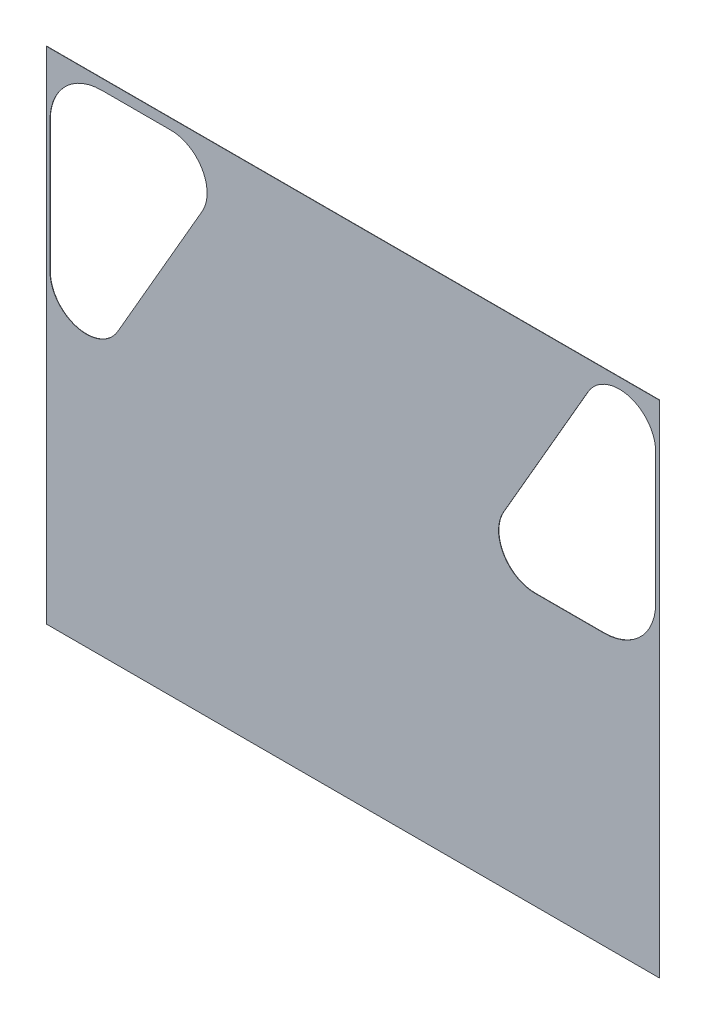
ISO-10303-21;
HEADER;
FILE_DESCRIPTION(('STEP AP214'),'2;1');
FILE_NAME('part.step','',(''),(''),'','','');
FILE_SCHEMA(('AUTOMOTIVE_DESIGN { 1 0 10303 214 1 1 1 1 }'));
ENDSEC;
DATA;
#1=APPLICATION_CONTEXT('core data for automotive mechanical design processes');
#2=APPLICATION_PROTOCOL_DEFINITION('international standard','automotive_design',2000,#1);
#3=PRODUCT_CONTEXT('',#1,'mechanical');
#4=PRODUCT('Part','Part','',(#3));
#5=PRODUCT_RELATED_PRODUCT_CATEGORY('part','',(#4));
#6=PRODUCT_DEFINITION_FORMATION('','',#4);
#7=PRODUCT_DEFINITION_CONTEXT('part definition',#1,'design');
#8=PRODUCT_DEFINITION('design','',#6,#7);
#9=PRODUCT_DEFINITION_SHAPE('','',#8);
#10=(LENGTH_UNIT() NAMED_UNIT(*) SI_UNIT(.MILLI.,.METRE.));
#11=(NAMED_UNIT(*) PLANE_ANGLE_UNIT() SI_UNIT($,.RADIAN.));
#12=(NAMED_UNIT(*) SI_UNIT($,.STERADIAN.) SOLID_ANGLE_UNIT());
#13=UNCERTAINTY_MEASURE_WITH_UNIT(LENGTH_MEASURE(1.E-05),#10,'distance_accuracy_value','');
#14=(GEOMETRIC_REPRESENTATION_CONTEXT(3) GLOBAL_UNCERTAINTY_ASSIGNED_CONTEXT((#13)) GLOBAL_UNIT_ASSIGNED_CONTEXT((#10,
#11,#12)) REPRESENTATION_CONTEXT('',''));
#15=CARTESIAN_POINT('',(0.,0.,0.));
#16=DIRECTION('',(0.,0.,1.));
#17=DIRECTION('',(1.,0.,0.));
#18=AXIS2_PLACEMENT_3D('',#15,#16,#17);
#19=CARTESIAN_POINT('',(0.,0.,1.));
#20=DIRECTION('',(1.,0.,0.));
#21=DIRECTION('',(0.,1.,0.));
#22=AXIS2_PLACEMENT_3D('',#19,#20,#21);
#23=PLANE('',#22);
#24=DIRECTION('',(0.,-1.,0.));
#25=VECTOR('',#24,1.);
#26=CARTESIAN_POINT('',(0.,0.,0.));
#27=LINE('',#26,#25);
#28=CARTESIAN_POINT('',(-4.44089209850063E-13,1625.,0.));
#29=VERTEX_POINT('',#28);
#30=CARTESIAN_POINT('',(0.,0.,0.));
#31=VERTEX_POINT('',#30);
#32=EDGE_CURVE('E195',#29,#31,#27,.T.);
#33=ORIENTED_EDGE('',*,*,#32,.T.);
#34=DIRECTION('',(0.,0.,-1.));
#35=VECTOR('',#34,1.);
#36=CARTESIAN_POINT('',(0.,0.,1.));
#37=LINE('',#36,#35);
#38=CARTESIAN_POINT('',(0.,0.,1.));
#39=VERTEX_POINT('',#38);
#40=EDGE_CURVE('E11',#39,#31,#37,.T.);
#41=ORIENTED_EDGE('',*,*,#40,.F.);
#42=DIRECTION('',(0.,-1.,0.));
#43=VECTOR('',#42,1.);
#44=CARTESIAN_POINT('',(0.,0.,1.));
#45=LINE('',#44,#43);
#46=CARTESIAN_POINT('',(-4.44089209850063E-13,1625.,1.));
#47=VERTEX_POINT('',#46);
#48=EDGE_CURVE('E248',#47,#39,#45,.T.);
#49=ORIENTED_EDGE('',*,*,#48,.F.);
#50=DIRECTION('',(0.,0.,-1.));
#51=VECTOR('',#50,1.);
#52=CARTESIAN_POINT('',(-4.44089209850063E-13,1625.,1.));
#53=LINE('',#52,#51);
#54=EDGE_CURVE('E258',#47,#29,#53,.T.);
#55=ORIENTED_EDGE('',*,*,#54,.T.);
#56=EDGE_LOOP('',(#33,#41,#49,#55));
#57=FACE_BOUND('',#56,.T.);
#58=ADVANCED_FACE('F34',(#57),#23,.F.);
#59=CARTESIAN_POINT('',(0.,0.,1.));
#60=DIRECTION('',(0.,1.,0.));
#61=DIRECTION('',(0.,0.,1.));
#62=AXIS2_PLACEMENT_3D('',#59,#60,#61);
#63=PLANE('',#62);
#64=DIRECTION('',(1.,0.,0.));
#65=VECTOR('',#64,1.);
#66=CARTESIAN_POINT('',(0.,0.,0.));
#67=LINE('',#66,#65);
#68=CARTESIAN_POINT('',(1991.,0.,0.));
#69=VERTEX_POINT('',#68);
#70=EDGE_CURVE('E261',#31,#69,#67,.T.);
#71=ORIENTED_EDGE('',*,*,#70,.T.);
#72=DIRECTION('',(0.,0.,-1.));
#73=VECTOR('',#72,1.);
#74=CARTESIAN_POINT('',(1991.,0.,1.));
#75=LINE('',#74,#73);
#76=CARTESIAN_POINT('',(1991.,0.,1.));
#77=VERTEX_POINT('',#76);
#78=EDGE_CURVE('E41',#77,#69,#75,.T.);
#79=ORIENTED_EDGE('',*,*,#78,.F.);
#80=DIRECTION('',(1.,0.,0.));
#81=VECTOR('',#80,1.);
#82=CARTESIAN_POINT('',(0.,0.,1.));
#83=LINE('',#82,#81);
#84=EDGE_CURVE('E251',#39,#77,#83,.T.);
#85=ORIENTED_EDGE('',*,*,#84,.F.);
#86=ORIENTED_EDGE('',*,*,#40,.T.);
#87=EDGE_LOOP('',(#71,#79,#85,#86));
#88=FACE_BOUND('',#87,.T.);
#89=ADVANCED_FACE('F290',(#88),#63,.F.);
#90=CARTESIAN_POINT('',(1991.,0.,1.));
#91=DIRECTION('',(-1.,0.,0.));
#92=DIRECTION('',(0.,-1.,0.));
#93=AXIS2_PLACEMENT_3D('',#90,#91,#92);
#94=PLANE('',#93);
#95=DIRECTION('',(0.,1.,0.));
#96=VECTOR('',#95,1.);
#97=CARTESIAN_POINT('',(1991.,0.,0.));
#98=LINE('',#97,#96);
#99=CARTESIAN_POINT('',(1991.,1625.,0.));
#100=VERTEX_POINT('',#99);
#101=EDGE_CURVE('E263',#69,#100,#98,.T.);
#102=ORIENTED_EDGE('',*,*,#101,.T.);
#103=DIRECTION('',(0.,0.,-1.));
#104=VECTOR('',#103,1.);
#105=CARTESIAN_POINT('',(1991.,1625.,1.));
#106=LINE('',#105,#104);
#107=CARTESIAN_POINT('',(1991.,1625.,1.));
#108=VERTEX_POINT('',#107);
#109=EDGE_CURVE('E268',#108,#100,#106,.T.);
#110=ORIENTED_EDGE('',*,*,#109,.F.);
#111=DIRECTION('',(0.,1.,0.));
#112=VECTOR('',#111,1.);
#113=CARTESIAN_POINT('',(1991.,0.,1.));
#114=LINE('',#113,#112);
#115=EDGE_CURVE('E254',#77,#108,#114,.T.);
#116=ORIENTED_EDGE('',*,*,#115,.F.);
#117=ORIENTED_EDGE('',*,*,#78,.T.);
#118=EDGE_LOOP('',(#102,#110,#116,#117));
#119=FACE_BOUND('',#118,.T.);
#120=ADVANCED_FACE('F275',(#119),#94,.F.);
#121=CARTESIAN_POINT('',(-4.44089209850063E-13,1625.,1.));
#122=DIRECTION('',(0.,-1.,0.));
#123=DIRECTION('',(0.,0.,-1.));
#124=AXIS2_PLACEMENT_3D('',#121,#122,#123);
#125=PLANE('',#124);
#126=DIRECTION('',(-1.,0.,0.));
#127=VECTOR('',#126,1.);
#128=CARTESIAN_POINT('',(-4.44089209850063E-13,1625.,0.));
#129=LINE('',#128,#127);
#130=EDGE_CURVE('E252',#100,#29,#129,.T.);
#131=ORIENTED_EDGE('',*,*,#130,.T.);
#132=ORIENTED_EDGE('',*,*,#54,.F.);
#133=DIRECTION('',(-1.,0.,0.));
#134=VECTOR('',#133,1.);
#135=CARTESIAN_POINT('',(-4.44089209850063E-13,1625.,1.));
#136=LINE('',#135,#134);
#137=EDGE_CURVE('E256',#108,#47,#136,.T.);
#138=ORIENTED_EDGE('',*,*,#137,.F.);
#139=ORIENTED_EDGE('',*,*,#109,.T.);
#140=EDGE_LOOP('',(#131,#132,#138,#139));
#141=FACE_BOUND('',#140,.T.);
#142=ADVANCED_FACE('F283',(#141),#125,.F.);
#143=CARTESIAN_POINT('',(0.,0.,1.));
#144=DIRECTION('',(0.,0.,-1.));
#145=DIRECTION('',(-1.,0.,0.));
#146=AXIS2_PLACEMENT_3D('',#143,#144,#145);
#147=PLANE('',#146);
#148=DIRECTION('',(0.,1.,0.));
#149=VECTOR('',#148,1.);
#150=CARTESIAN_POINT('',(1979.,1048.,0.99999999999989));
#151=LINE('',#150,#149);
#152=CARTESIAN_POINT('',(1979.,1048.,1.));
#153=VERTEX_POINT('',#152);
#154=CARTESIAN_POINT('',(1979.,1473.,0.99999999999989));
#155=VERTEX_POINT('',#154);
#156=EDGE_CURVE('E182',#153,#155,#151,.T.);
#157=ORIENTED_EDGE('',*,*,#156,.F.);
#158=CARTESIAN_POINT('',(1811.,1048.,0.99999999999989));
#159=DIRECTION('',(0.,0.,1.));
#160=DIRECTION('',(1.,0.,0.));
#161=AXIS2_PLACEMENT_3D('',#158,#159,#160);
#162=CIRCLE('',#161,168.);
#163=CARTESIAN_POINT('',(1811.,880.,0.99999999999989));
#164=VERTEX_POINT('',#163);
#165=EDGE_CURVE('E48',#164,#153,#162,.T.);
#166=ORIENTED_EDGE('',*,*,#165,.F.);
#167=DIRECTION('',(1.,0.,0.));
#168=VECTOR('',#167,1.);
#169=CARTESIAN_POINT('',(1586.76,880.,0.99999999999989));
#170=LINE('',#169,#168);
#171=CARTESIAN_POINT('',(1586.76,880.,0.99999999999989));
#172=VERTEX_POINT('',#171);
#173=EDGE_CURVE('E168',#172,#164,#170,.T.);
#174=ORIENTED_EDGE('',*,*,#173,.F.);
#175=CARTESIAN_POINT('',(1586.76,998.,0.99999999999989));
#176=DIRECTION('',(0.,0.,1.));
#177=DIRECTION('',(1.,0.,0.));
#178=AXIS2_PLACEMENT_3D('',#175,#176,#177);
#179=CIRCLE('',#178,118.);
#180=CARTESIAN_POINT('',(1484.56887399451,1056.99977767526,0.99999999999989));
#181=VERTEX_POINT('',#180);
#182=EDGE_CURVE('E171',#181,#172,#179,.T.);
#183=ORIENTED_EDGE('',*,*,#182,.F.);
#184=DIRECTION('',(-0.499998115891994,-0.86602649157197,0.));
#185=VECTOR('',#184,1.);
#186=CARTESIAN_POINT('',(1758.80887399451,1531.99977767526,0.99999999999989));
#187=LINE('',#186,#185);
#188=CARTESIAN_POINT('',(1758.80887399451,1531.99977767526,0.99999999999989));
#189=VERTEX_POINT('',#188);
#190=EDGE_CURVE('E188',#189,#181,#187,.T.);
#191=ORIENTED_EDGE('',*,*,#190,.F.);
#192=CARTESIAN_POINT('',(1861.,1473.,0.99999999999989));
#193=DIRECTION('',(0.,0.,1.));
#194=DIRECTION('',(-1.,0.,0.));
#195=AXIS2_PLACEMENT_3D('',#192,#193,#194);
#196=CIRCLE('',#195,118.);
#197=EDGE_CURVE('E185',#155,#189,#196,.T.);
#198=ORIENTED_EDGE('',*,*,#197,.F.);
#199=EDGE_LOOP('',(#157,#166,#174,#183,#191,#198));
#200=FACE_BOUND('',#199,.T.);
#201=DIRECTION('',(0.499998115891994,0.866026491571971,0.));
#202=VECTOR('',#201,1.);
#203=CARTESIAN_POINT('',(232.191126005492,939.000222324744,0.99999999999989));
#204=LINE('',#203,#202);
#205=CARTESIAN_POINT('',(232.191126005492,939.000222324744,1.));
#206=VERTEX_POINT('',#205);
#207=CARTESIAN_POINT('',(506.431126005492,1414.00022232474,0.99999999999989));
#208=VERTEX_POINT('',#207);
#209=EDGE_CURVE('E224',#206,#208,#204,.T.);
#210=ORIENTED_EDGE('',*,*,#209,.F.);
#211=CARTESIAN_POINT('',(130.,998.,0.99999999999989));
#212=DIRECTION('',(0.,0.,1.));
#213=DIRECTION('',(1.,0.,0.));
#214=AXIS2_PLACEMENT_3D('',#211,#212,#213);
#215=CIRCLE('',#214,118.);
#216=CARTESIAN_POINT('',(11.9999999999996,998.,0.99999999999989));
#217=VERTEX_POINT('',#216);
#218=EDGE_CURVE('E56',#217,#206,#215,.T.);
#219=ORIENTED_EDGE('',*,*,#218,.F.);
#220=DIRECTION('',(0.,-1.,0.));
#221=VECTOR('',#220,1.);
#222=CARTESIAN_POINT('',(11.9999999999996,1423.,0.99999999999989));
#223=LINE('',#222,#221);
#224=CARTESIAN_POINT('',(11.9999999999996,1423.,0.99999999999989));
#225=VERTEX_POINT('',#224);
#226=EDGE_CURVE('E207',#225,#217,#223,.T.);
#227=ORIENTED_EDGE('',*,*,#226,.F.);
#228=CARTESIAN_POINT('',(180.,1423.,0.99999999999989));
#229=DIRECTION('',(0.,0.,1.));
#230=DIRECTION('',(-1.,0.,0.));
#231=AXIS2_PLACEMENT_3D('',#228,#229,#230);
#232=CIRCLE('',#231,168.);
#233=CARTESIAN_POINT('',(180.,1591.,0.99999999999989));
#234=VERTEX_POINT('',#233);
#235=EDGE_CURVE('E233',#234,#225,#232,.T.);
#236=ORIENTED_EDGE('',*,*,#235,.F.);
#237=DIRECTION('',(-1.,0.,0.));
#238=VECTOR('',#237,1.);
#239=CARTESIAN_POINT('',(404.24,1591.,0.99999999999989));
#240=LINE('',#239,#238);
#241=CARTESIAN_POINT('',(404.24,1591.,0.99999999999989));
#242=VERTEX_POINT('',#241);
#243=EDGE_CURVE('E230',#242,#234,#240,.T.);
#244=ORIENTED_EDGE('',*,*,#243,.F.);
#245=CARTESIAN_POINT('',(404.24,1473.,0.99999999999989));
#246=DIRECTION('',(0.,0.,1.));
#247=DIRECTION('',(1.,0.,0.));
#248=AXIS2_PLACEMENT_3D('',#245,#246,#247);
#249=CIRCLE('',#248,118.);
#250=EDGE_CURVE('E227',#208,#242,#249,.T.);
#251=ORIENTED_EDGE('',*,*,#250,.F.);
#252=EDGE_LOOP('',(#210,#219,#227,#236,#244,#251));
#253=FACE_BOUND('',#252,.T.);
#254=ORIENTED_EDGE('',*,*,#48,.T.);
#255=ORIENTED_EDGE('',*,*,#84,.T.);
#256=ORIENTED_EDGE('',*,*,#115,.T.);
#257=ORIENTED_EDGE('',*,*,#137,.T.);
#258=EDGE_LOOP('',(#254,#255,#256,#257));
#259=FACE_BOUND('',#258,.T.);
#260=ADVANCED_FACE('F289',(#200,#253,#259),#147,.F.);
#261=CARTESIAN_POINT('',(0.,0.,0.));
#262=DIRECTION('',(0.,0.,-1.));
#263=DIRECTION('',(-1.,0.,0.));
#264=AXIS2_PLACEMENT_3D('',#261,#262,#263);
#265=PLANE('',#264);
#266=CARTESIAN_POINT('',(1811.,1048.,0.));
#267=DIRECTION('',(0.,0.,1.));
#268=DIRECTION('',(1.,0.,0.));
#269=AXIS2_PLACEMENT_3D('',#266,#267,#268);
#270=CIRCLE('',#269,168.);
#271=CARTESIAN_POINT('',(1811.,880.,0.));
#272=VERTEX_POINT('',#271);
#273=CARTESIAN_POINT('',(1979.,1048.,0.));
#274=VERTEX_POINT('',#273);
#275=EDGE_CURVE('E148',#272,#274,#270,.T.);
#276=ORIENTED_EDGE('',*,*,#275,.T.);
#277=DIRECTION('',(0.,1.,0.));
#278=VECTOR('',#277,1.);
#279=CARTESIAN_POINT('',(1979.,1048.,0.));
#280=LINE('',#279,#278);
#281=CARTESIAN_POINT('',(1979.,1473.,0.));
#282=VERTEX_POINT('',#281);
#283=EDGE_CURVE('E158',#274,#282,#280,.T.);
#284=ORIENTED_EDGE('',*,*,#283,.T.);
#285=CARTESIAN_POINT('',(1861.,1473.,0.));
#286=DIRECTION('',(0.,0.,1.));
#287=DIRECTION('',(-1.,0.,0.));
#288=AXIS2_PLACEMENT_3D('',#285,#286,#287);
#289=CIRCLE('',#288,118.);
#290=CARTESIAN_POINT('',(1758.80887399451,1531.99977767526,0.));
#291=VERTEX_POINT('',#290);
#292=EDGE_CURVE('E162',#282,#291,#289,.T.);
#293=ORIENTED_EDGE('',*,*,#292,.T.);
#294=DIRECTION('',(-0.499998115891994,-0.86602649157197,0.));
#295=VECTOR('',#294,1.);
#296=CARTESIAN_POINT('',(1758.80887399451,1531.99977767526,0.));
#297=LINE('',#296,#295);
#298=CARTESIAN_POINT('',(1484.56887399451,1056.99977767526,0.));
#299=VERTEX_POINT('',#298);
#300=EDGE_CURVE('E175',#291,#299,#297,.T.);
#301=ORIENTED_EDGE('',*,*,#300,.T.);
#302=CARTESIAN_POINT('',(1586.76,998.,0.));
#303=DIRECTION('',(0.,0.,1.));
#304=DIRECTION('',(1.,0.,0.));
#305=AXIS2_PLACEMENT_3D('',#302,#303,#304);
#306=CIRCLE('',#305,118.);
#307=CARTESIAN_POINT('',(1586.76,880.,0.));
#308=VERTEX_POINT('',#307);
#309=EDGE_CURVE('E178',#299,#308,#306,.T.);
#310=ORIENTED_EDGE('',*,*,#309,.T.);
#311=DIRECTION('',(1.,0.,0.));
#312=VECTOR('',#311,1.);
#313=CARTESIAN_POINT('',(1586.76,880.,0.));
#314=LINE('',#313,#312);
#315=EDGE_CURVE('E154',#308,#272,#314,.T.);
#316=ORIENTED_EDGE('',*,*,#315,.T.);
#317=EDGE_LOOP('',(#276,#284,#293,#301,#310,#316));
#318=FACE_BOUND('',#317,.T.);
#319=CARTESIAN_POINT('',(130.,998.,0.));
#320=DIRECTION('',(0.,0.,1.));
#321=DIRECTION('',(1.,0.,0.));
#322=AXIS2_PLACEMENT_3D('',#319,#320,#321);
#323=CIRCLE('',#322,118.);
#324=CARTESIAN_POINT('',(11.9999999999996,998.,0.));
#325=VERTEX_POINT('',#324);
#326=CARTESIAN_POINT('',(232.191126005492,939.000222324744,0.));
#327=VERTEX_POINT('',#326);
#328=EDGE_CURVE('E203',#325,#327,#323,.T.);
#329=ORIENTED_EDGE('',*,*,#328,.T.);
#330=DIRECTION('',(0.499998115891994,0.866026491571971,0.));
#331=VECTOR('',#330,1.);
#332=CARTESIAN_POINT('',(232.191126005492,939.000222324744,0.));
#333=LINE('',#332,#331);
#334=CARTESIAN_POINT('',(506.431126005492,1414.00022232474,0.));
#335=VERTEX_POINT('',#334);
#336=EDGE_CURVE('E206',#327,#335,#333,.T.);
#337=ORIENTED_EDGE('',*,*,#336,.T.);
#338=CARTESIAN_POINT('',(404.24,1473.,0.));
#339=DIRECTION('',(0.,0.,1.));
#340=DIRECTION('',(1.,0.,0.));
#341=AXIS2_PLACEMENT_3D('',#338,#339,#340);
#342=CIRCLE('',#341,118.);
#343=CARTESIAN_POINT('',(404.24,1591.,0.));
#344=VERTEX_POINT('',#343);
#345=EDGE_CURVE('E210',#335,#344,#342,.T.);
#346=ORIENTED_EDGE('',*,*,#345,.T.);
#347=DIRECTION('',(-1.,0.,0.));
#348=VECTOR('',#347,1.);
#349=CARTESIAN_POINT('',(404.24,1591.,0.));
#350=LINE('',#349,#348);
#351=CARTESIAN_POINT('',(180.,1591.,0.));
#352=VERTEX_POINT('',#351);
#353=EDGE_CURVE('E213',#344,#352,#350,.T.);
#354=ORIENTED_EDGE('',*,*,#353,.T.);
#355=CARTESIAN_POINT('',(180.,1423.,0.));
#356=DIRECTION('',(0.,0.,1.));
#357=DIRECTION('',(-1.,0.,0.));
#358=AXIS2_PLACEMENT_3D('',#355,#356,#357);
#359=CIRCLE('',#358,168.);
#360=CARTESIAN_POINT('',(11.9999999999996,1423.,0.));
#361=VERTEX_POINT('',#360);
#362=EDGE_CURVE('E216',#352,#361,#359,.T.);
#363=ORIENTED_EDGE('',*,*,#362,.T.);
#364=DIRECTION('',(0.,-1.,0.));
#365=VECTOR('',#364,1.);
#366=CARTESIAN_POINT('',(11.9999999999996,1423.,0.));
#367=LINE('',#366,#365);
#368=EDGE_CURVE('E219',#361,#325,#367,.T.);
#369=ORIENTED_EDGE('',*,*,#368,.T.);
#370=EDGE_LOOP('',(#329,#337,#346,#354,#363,#369));
#371=FACE_BOUND('',#370,.T.);
#372=ORIENTED_EDGE('',*,*,#32,.F.);
#373=ORIENTED_EDGE('',*,*,#130,.F.);
#374=ORIENTED_EDGE('',*,*,#101,.F.);
#375=ORIENTED_EDGE('',*,*,#70,.F.);
#376=EDGE_LOOP('',(#372,#373,#374,#375));
#377=FACE_BOUND('',#376,.T.);
#378=ADVANCED_FACE('F164',(#318,#371,#377),#265,.T.);
#379=CARTESIAN_POINT('',(130.,998.,0.));
#380=DIRECTION('',(0.,0.,1.));
#381=DIRECTION('',(1.,0.,0.));
#382=AXIS2_PLACEMENT_3D('',#379,#380,#381);
#383=CYLINDRICAL_SURFACE('',#382,118.);
#384=ORIENTED_EDGE('',*,*,#218,.T.);
#385=DIRECTION('',(0.,0.,1.));
#386=VECTOR('',#385,1.);
#387=CARTESIAN_POINT('',(232.191126005492,939.000222324744,0.));
#388=LINE('',#387,#386);
#389=EDGE_CURVE('E222',#327,#206,#388,.T.);
#390=ORIENTED_EDGE('',*,*,#389,.F.);
#391=ORIENTED_EDGE('',*,*,#328,.F.);
#392=DIRECTION('',(0.,0.,1.));
#393=VECTOR('',#392,1.);
#394=CARTESIAN_POINT('',(11.9999999999996,998.,0.));
#395=LINE('',#394,#393);
#396=EDGE_CURVE('E183',#325,#217,#395,.T.);
#397=ORIENTED_EDGE('',*,*,#396,.T.);
#398=EDGE_LOOP('',(#384,#390,#391,#397));
#399=FACE_BOUND('',#398,.T.);
#400=ADVANCED_FACE('F302',(#399),#383,.F.);
#401=CARTESIAN_POINT('',(11.9999999999996,1423.,0.));
#402=DIRECTION('',(-1.,0.,0.));
#403=DIRECTION('',(0.,-1.,0.));
#404=AXIS2_PLACEMENT_3D('',#401,#402,#403);
#405=PLANE('',#404);
#406=ORIENTED_EDGE('',*,*,#226,.T.);
#407=ORIENTED_EDGE('',*,*,#396,.F.);
#408=ORIENTED_EDGE('',*,*,#368,.F.);
#409=DIRECTION('',(0.,0.,1.));
#410=VECTOR('',#409,1.);
#411=CARTESIAN_POINT('',(11.9999999999996,1423.,0.));
#412=LINE('',#411,#410);
#413=EDGE_CURVE('E239',#361,#225,#412,.T.);
#414=ORIENTED_EDGE('',*,*,#413,.T.);
#415=EDGE_LOOP('',(#406,#407,#408,#414));
#416=FACE_BOUND('',#415,.T.);
#417=ADVANCED_FACE('F308',(#416),#405,.F.);
#418=CARTESIAN_POINT('',(180.,1423.,0.));
#419=DIRECTION('',(0.,0.,1.));
#420=DIRECTION('',(1.,0.,0.));
#421=AXIS2_PLACEMENT_3D('',#418,#419,#420);
#422=CYLINDRICAL_SURFACE('',#421,168.);
#423=ORIENTED_EDGE('',*,*,#235,.T.);
#424=ORIENTED_EDGE('',*,*,#413,.F.);
#425=ORIENTED_EDGE('',*,*,#362,.F.);
#426=DIRECTION('',(0.,0.,1.));
#427=VECTOR('',#426,1.);
#428=CARTESIAN_POINT('',(180.,1591.,0.));
#429=LINE('',#428,#427);
#430=EDGE_CURVE('E241',#352,#234,#429,.T.);
#431=ORIENTED_EDGE('',*,*,#430,.T.);
#432=EDGE_LOOP('',(#423,#424,#425,#431));
#433=FACE_BOUND('',#432,.T.);
#434=ADVANCED_FACE('F320',(#433),#422,.F.);
#435=CARTESIAN_POINT('',(404.24,1591.,0.));
#436=DIRECTION('',(0.,1.,0.));
#437=DIRECTION('',(0.,0.,1.));
#438=AXIS2_PLACEMENT_3D('',#435,#436,#437);
#439=PLANE('',#438);
#440=ORIENTED_EDGE('',*,*,#243,.T.);
#441=ORIENTED_EDGE('',*,*,#430,.F.);
#442=ORIENTED_EDGE('',*,*,#353,.F.);
#443=DIRECTION('',(0.,0.,1.));
#444=VECTOR('',#443,1.);
#445=CARTESIAN_POINT('',(404.24,1591.,0.));
#446=LINE('',#445,#444);
#447=EDGE_CURVE('E243',#344,#242,#446,.T.);
#448=ORIENTED_EDGE('',*,*,#447,.T.);
#449=EDGE_LOOP('',(#440,#441,#442,#448));
#450=FACE_BOUND('',#449,.T.);
#451=ADVANCED_FACE('F316',(#450),#439,.F.);
#452=CARTESIAN_POINT('',(404.24,1473.,0.));
#453=DIRECTION('',(0.,0.,1.));
#454=DIRECTION('',(1.,0.,0.));
#455=AXIS2_PLACEMENT_3D('',#452,#453,#454);
#456=CYLINDRICAL_SURFACE('',#455,118.);
#457=ORIENTED_EDGE('',*,*,#250,.T.);
#458=ORIENTED_EDGE('',*,*,#447,.F.);
#459=ORIENTED_EDGE('',*,*,#345,.F.);
#460=DIRECTION('',(0.,0.,1.));
#461=VECTOR('',#460,1.);
#462=CARTESIAN_POINT('',(506.431126005492,1414.00022232474,0.));
#463=LINE('',#462,#461);
#464=EDGE_CURVE('E245',#335,#208,#463,.T.);
#465=ORIENTED_EDGE('',*,*,#464,.T.);
#466=EDGE_LOOP('',(#457,#458,#459,#465));
#467=FACE_BOUND('',#466,.T.);
#468=ADVANCED_FACE('F312',(#467),#456,.F.);
#469=CARTESIAN_POINT('',(232.191126005492,939.000222324744,0.));
#470=DIRECTION('',(0.866026491571971,-0.499998115891994,0.));
#471=DIRECTION('',(0.499998115891994,0.866026491571971,0.));
#472=AXIS2_PLACEMENT_3D('',#469,#470,#471);
#473=PLANE('',#472);
#474=ORIENTED_EDGE('',*,*,#209,.T.);
#475=ORIENTED_EDGE('',*,*,#464,.F.);
#476=ORIENTED_EDGE('',*,*,#336,.F.);
#477=ORIENTED_EDGE('',*,*,#389,.T.);
#478=EDGE_LOOP('',(#474,#475,#476,#477));
#479=FACE_BOUND('',#478,.T.);
#480=ADVANCED_FACE('F309',(#479),#473,.F.);
#481=CARTESIAN_POINT('',(1811.,1048.,0.));
#482=DIRECTION('',(0.,0.,1.));
#483=DIRECTION('',(1.,0.,0.));
#484=AXIS2_PLACEMENT_3D('',#481,#482,#483);
#485=CYLINDRICAL_SURFACE('',#484,168.);
#486=ORIENTED_EDGE('',*,*,#165,.T.);
#487=DIRECTION('',(0.,0.,1.));
#488=VECTOR('',#487,1.);
#489=CARTESIAN_POINT('',(1979.,1048.,0.));
#490=LINE('',#489,#488);
#491=EDGE_CURVE('E144',#274,#153,#490,.T.);
#492=ORIENTED_EDGE('',*,*,#491,.F.);
#493=ORIENTED_EDGE('',*,*,#275,.F.);
#494=DIRECTION('',(0.,0.,1.));
#495=VECTOR('',#494,1.);
#496=CARTESIAN_POINT('',(1811.,880.,0.));
#497=LINE('',#496,#495);
#498=EDGE_CURVE('E193',#272,#164,#497,.T.);
#499=ORIENTED_EDGE('',*,*,#498,.T.);
#500=EDGE_LOOP('',(#486,#492,#493,#499));
#501=FACE_BOUND('',#500,.T.);
#502=ADVANCED_FACE('F146',(#501),#485,.F.);
#503=CARTESIAN_POINT('',(1586.76,880.,0.));
#504=DIRECTION('',(0.,-1.,0.));
#505=DIRECTION('',(1.,0.,0.));
#506=AXIS2_PLACEMENT_3D('',#503,#504,#505);
#507=PLANE('',#506);
#508=ORIENTED_EDGE('',*,*,#173,.T.);
#509=ORIENTED_EDGE('',*,*,#498,.F.);
#510=ORIENTED_EDGE('',*,*,#315,.F.);
#511=DIRECTION('',(0.,0.,1.));
#512=VECTOR('',#511,1.);
#513=CARTESIAN_POINT('',(1586.76,880.,0.));
#514=LINE('',#513,#512);
#515=EDGE_CURVE('E196',#308,#172,#514,.T.);
#516=ORIENTED_EDGE('',*,*,#515,.T.);
#517=EDGE_LOOP('',(#508,#509,#510,#516));
#518=FACE_BOUND('',#517,.T.);
#519=ADVANCED_FACE('F330',(#518),#507,.F.);
#520=CARTESIAN_POINT('',(1586.76,998.,0.));
#521=DIRECTION('',(0.,0.,1.));
#522=DIRECTION('',(1.,0.,0.));
#523=AXIS2_PLACEMENT_3D('',#520,#521,#522);
#524=CYLINDRICAL_SURFACE('',#523,118.);
#525=ORIENTED_EDGE('',*,*,#182,.T.);
#526=ORIENTED_EDGE('',*,*,#515,.F.);
#527=ORIENTED_EDGE('',*,*,#309,.F.);
#528=DIRECTION('',(0.,0.,1.));
#529=VECTOR('',#528,1.);
#530=CARTESIAN_POINT('',(1484.56887399451,1056.99977767526,0.));
#531=LINE('',#530,#529);
#532=EDGE_CURVE('E198',#299,#181,#531,.T.);
#533=ORIENTED_EDGE('',*,*,#532,.T.);
#534=EDGE_LOOP('',(#525,#526,#527,#533));
#535=FACE_BOUND('',#534,.T.);
#536=ADVANCED_FACE('F340',(#535),#524,.F.);
#537=CARTESIAN_POINT('',(1758.80887399451,1531.99977767526,0.));
#538=DIRECTION('',(-0.866026491571971,0.499998115891994,0.));
#539=DIRECTION('',(-0.499998115891994,-0.866026491571971,0.));
#540=AXIS2_PLACEMENT_3D('',#537,#538,#539);
#541=PLANE('',#540);
#542=ORIENTED_EDGE('',*,*,#190,.T.);
#543=ORIENTED_EDGE('',*,*,#532,.F.);
#544=ORIENTED_EDGE('',*,*,#300,.F.);
#545=DIRECTION('',(0.,0.,1.));
#546=VECTOR('',#545,1.);
#547=CARTESIAN_POINT('',(1758.80887399451,1531.99977767526,0.));
#548=LINE('',#547,#546);
#549=EDGE_CURVE('E200',#291,#189,#548,.T.);
#550=ORIENTED_EDGE('',*,*,#549,.T.);
#551=EDGE_LOOP('',(#542,#543,#544,#550));
#552=FACE_BOUND('',#551,.T.);
#553=ADVANCED_FACE('F336',(#552),#541,.F.);
#554=CARTESIAN_POINT('',(1861.,1473.,0.));
#555=DIRECTION('',(0.,0.,1.));
#556=DIRECTION('',(1.,0.,0.));
#557=AXIS2_PLACEMENT_3D('',#554,#555,#556);
#558=CYLINDRICAL_SURFACE('',#557,118.);
#559=ORIENTED_EDGE('',*,*,#197,.T.);
#560=ORIENTED_EDGE('',*,*,#549,.F.);
#561=ORIENTED_EDGE('',*,*,#292,.F.);
#562=DIRECTION('',(0.,0.,1.));
#563=VECTOR('',#562,1.);
#564=CARTESIAN_POINT('',(1979.,1473.,0.));
#565=LINE('',#564,#563);
#566=EDGE_CURVE('E153',#282,#155,#565,.T.);
#567=ORIENTED_EDGE('',*,*,#566,.T.);
#568=EDGE_LOOP('',(#559,#560,#561,#567));
#569=FACE_BOUND('',#568,.T.);
#570=ADVANCED_FACE('F333',(#569),#558,.F.);
#571=CARTESIAN_POINT('',(1979.,1048.,0.));
#572=DIRECTION('',(1.,0.,0.));
#573=DIRECTION('',(0.,0.,-1.));
#574=AXIS2_PLACEMENT_3D('',#571,#572,#573);
#575=PLANE('',#574);
#576=ORIENTED_EDGE('',*,*,#156,.T.);
#577=ORIENTED_EDGE('',*,*,#566,.F.);
#578=ORIENTED_EDGE('',*,*,#283,.F.);
#579=ORIENTED_EDGE('',*,*,#491,.T.);
#580=EDGE_LOOP('',(#576,#577,#578,#579));
#581=FACE_BOUND('',#580,.T.);
#582=ADVANCED_FACE('F159',(#581),#575,.F.);
#583=CLOSED_SHELL('',(#58,#89,#120,#142,#260,#378,#400,#417,#434,#451,#468,#480,#502,#519,#536,
#553,#570,#582));
#584=MANIFOLD_SOLID_BREP('B2',#583);
#585=ADVANCED_BREP_SHAPE_REPRESENTATION('',(#18,#584),#14);
#586=SHAPE_DEFINITION_REPRESENTATION(#9,#585);
ENDSEC;
END-ISO-10303-21;
